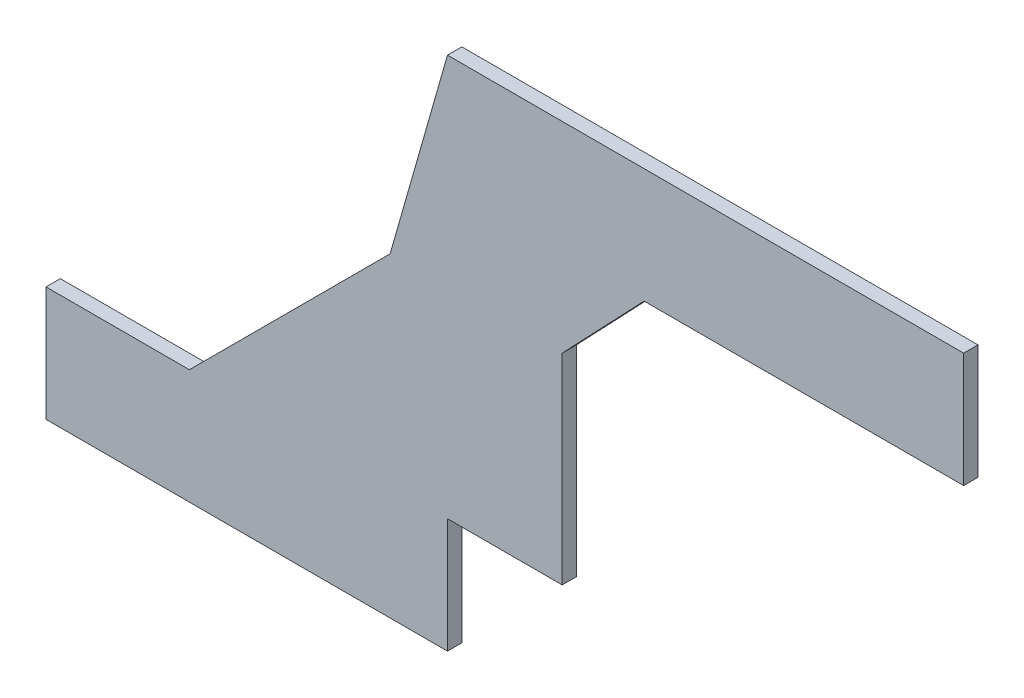
ISO-10303-21;
HEADER;
FILE_DESCRIPTION(('STEP AP214'),'2;1');
FILE_NAME('part.step','',(''),(''),'','','');
FILE_SCHEMA(('AUTOMOTIVE_DESIGN { 1 0 10303 214 1 1 1 1 }'));
ENDSEC;
DATA;
#1=APPLICATION_CONTEXT('core data for automotive mechanical design processes');
#2=APPLICATION_PROTOCOL_DEFINITION('international standard','automotive_design',2000,#1);
#3=PRODUCT_CONTEXT('',#1,'mechanical');
#4=PRODUCT('Part','Part','',(#3));
#5=PRODUCT_RELATED_PRODUCT_CATEGORY('part','',(#4));
#6=PRODUCT_DEFINITION_FORMATION('','',#4);
#7=PRODUCT_DEFINITION_CONTEXT('part definition',#1,'design');
#8=PRODUCT_DEFINITION('design','',#6,#7);
#9=PRODUCT_DEFINITION_SHAPE('','',#8);
#10=(LENGTH_UNIT() NAMED_UNIT(*) SI_UNIT(.MILLI.,.METRE.));
#11=(NAMED_UNIT(*) PLANE_ANGLE_UNIT() SI_UNIT($,.RADIAN.));
#12=(NAMED_UNIT(*) SI_UNIT($,.STERADIAN.) SOLID_ANGLE_UNIT());
#13=UNCERTAINTY_MEASURE_WITH_UNIT(LENGTH_MEASURE(1.E-05),#10,'distance_accuracy_value','');
#14=(GEOMETRIC_REPRESENTATION_CONTEXT(3) GLOBAL_UNCERTAINTY_ASSIGNED_CONTEXT((#13)) GLOBAL_UNIT_ASSIGNED_CONTEXT((#10,
#11,#12)) REPRESENTATION_CONTEXT('',''));
#15=CARTESIAN_POINT('',(0.,0.,0.));
#16=DIRECTION('',(0.,0.,1.));
#17=DIRECTION('',(1.,0.,0.));
#18=AXIS2_PLACEMENT_3D('',#15,#16,#17);
#19=CARTESIAN_POINT('',(0.,-12.7,3.175));
#20=DIRECTION('',(1.,0.,0.));
#21=DIRECTION('',(0.,0.,-1.));
#22=AXIS2_PLACEMENT_3D('',#19,#20,#21);
#23=PLANE('',#22);
#24=DIRECTION('',(0.,-1.,0.));
#25=VECTOR('',#24,1.);
#26=CARTESIAN_POINT('',(0.,-12.7,0.));
#27=LINE('',#26,#25);
#28=CARTESIAN_POINT('',(0.,12.7,0.));
#29=VERTEX_POINT('',#28);
#30=CARTESIAN_POINT('',(0.,-12.7,0.));
#31=VERTEX_POINT('',#30);
#32=EDGE_CURVE('E153',#29,#31,#27,.T.);
#33=ORIENTED_EDGE('',*,*,#32,.T.);
#34=DIRECTION('',(0.,0.,-1.));
#35=VECTOR('',#34,1.);
#36=CARTESIAN_POINT('',(0.,-12.7,3.175));
#37=LINE('',#36,#35);
#38=CARTESIAN_POINT('',(0.,-12.7,3.175));
#39=VERTEX_POINT('',#38);
#40=EDGE_CURVE('E11',#39,#31,#37,.T.);
#41=ORIENTED_EDGE('',*,*,#40,.F.);
#42=DIRECTION('',(0.,-1.,0.));
#43=VECTOR('',#42,1.);
#44=CARTESIAN_POINT('',(0.,-12.7,3.175));
#45=LINE('',#44,#43);
#46=CARTESIAN_POINT('',(0.,12.7,3.175));
#47=VERTEX_POINT('',#46);
#48=EDGE_CURVE('E175',#47,#39,#45,.T.);
#49=ORIENTED_EDGE('',*,*,#48,.F.);
#50=DIRECTION('',(0.,0.,-1.));
#51=VECTOR('',#50,1.);
#52=CARTESIAN_POINT('',(0.,12.7,3.175));
#53=LINE('',#52,#51);
#54=EDGE_CURVE('E149',#47,#29,#53,.T.);
#55=ORIENTED_EDGE('',*,*,#54,.T.);
#56=EDGE_LOOP('',(#33,#41,#49,#55));
#57=FACE_BOUND('',#56,.T.);
#58=ADVANCED_FACE('F33',(#57),#23,.F.);
#59=CARTESIAN_POINT('',(0.,-12.7,3.175));
#60=DIRECTION('',(0.,1.,0.));
#61=DIRECTION('',(0.,0.,1.));
#62=AXIS2_PLACEMENT_3D('',#59,#60,#61);
#63=PLANE('',#62);
#64=DIRECTION('',(1.,0.,0.));
#65=VECTOR('',#64,1.);
#66=CARTESIAN_POINT('',(0.,-12.7,0.));
#67=LINE('',#66,#65);
#68=CARTESIAN_POINT('',(88.9,-12.7,0.));
#69=VERTEX_POINT('',#68);
#70=EDGE_CURVE('E156',#31,#69,#67,.T.);
#71=ORIENTED_EDGE('',*,*,#70,.T.);
#72=DIRECTION('',(0.,0.,-1.));
#73=VECTOR('',#72,1.);
#74=CARTESIAN_POINT('',(88.9,-12.7,3.175));
#75=LINE('',#74,#73);
#76=CARTESIAN_POINT('',(88.9,-12.7,3.175));
#77=VERTEX_POINT('',#76);
#78=EDGE_CURVE('E41',#77,#69,#75,.T.);
#79=ORIENTED_EDGE('',*,*,#78,.F.);
#80=DIRECTION('',(1.,0.,0.));
#81=VECTOR('',#80,1.);
#82=CARTESIAN_POINT('',(0.,-12.7,3.175));
#83=LINE('',#82,#81);
#84=EDGE_CURVE('E104',#39,#77,#83,.T.);
#85=ORIENTED_EDGE('',*,*,#84,.F.);
#86=ORIENTED_EDGE('',*,*,#40,.T.);
#87=EDGE_LOOP('',(#71,#79,#85,#86));
#88=FACE_BOUND('',#87,.T.);
#89=ADVANCED_FACE('F253',(#88),#63,.F.);
#90=CARTESIAN_POINT('',(88.9,-12.7,3.175));
#91=DIRECTION('',(-1.,0.,0.));
#92=DIRECTION('',(0.,0.,1.));
#93=AXIS2_PLACEMENT_3D('',#90,#91,#92);
#94=PLANE('',#93);
#95=DIRECTION('',(0.,1.,0.));
#96=VECTOR('',#95,1.);
#97=CARTESIAN_POINT('',(88.9,-12.7,0.));
#98=LINE('',#97,#96);
#99=CARTESIAN_POINT('',(88.9,12.7,0.));
#100=VERTEX_POINT('',#99);
#101=EDGE_CURVE('E158',#69,#100,#98,.T.);
#102=ORIENTED_EDGE('',*,*,#101,.T.);
#103=DIRECTION('',(0.,0.,-1.));
#104=VECTOR('',#103,1.);
#105=CARTESIAN_POINT('',(88.9,12.7,3.175));
#106=LINE('',#105,#104);
#107=CARTESIAN_POINT('',(88.9,12.7,3.175));
#108=VERTEX_POINT('',#107);
#109=EDGE_CURVE('E194',#108,#100,#106,.T.);
#110=ORIENTED_EDGE('',*,*,#109,.F.);
#111=DIRECTION('',(0.,1.,0.));
#112=VECTOR('',#111,1.);
#113=CARTESIAN_POINT('',(88.9,-12.7,3.175));
#114=LINE('',#113,#112);
#115=EDGE_CURVE('E202',#77,#108,#114,.T.);
#116=ORIENTED_EDGE('',*,*,#115,.F.);
#117=ORIENTED_EDGE('',*,*,#78,.T.);
#118=EDGE_LOOP('',(#102,#110,#116,#117));
#119=FACE_BOUND('',#118,.T.);
#120=ADVANCED_FACE('F200',(#119),#94,.F.);
#121=CARTESIAN_POINT('',(88.9,12.7,3.175));
#122=DIRECTION('',(0.,1.,0.));
#123=DIRECTION('',(0.,0.,1.));
#124=AXIS2_PLACEMENT_3D('',#121,#122,#123);
#125=PLANE('',#124);
#126=DIRECTION('',(1.,0.,0.));
#127=VECTOR('',#126,1.);
#128=CARTESIAN_POINT('',(88.9,12.7,0.));
#129=LINE('',#128,#127);
#130=CARTESIAN_POINT('',(114.3,12.7,0.));
#131=VERTEX_POINT('',#130);
#132=EDGE_CURVE('E160',#100,#131,#129,.T.);
#133=ORIENTED_EDGE('',*,*,#132,.T.);
#134=DIRECTION('',(0.,0.,-1.));
#135=VECTOR('',#134,1.);
#136=CARTESIAN_POINT('',(114.3,12.7,3.175));
#137=LINE('',#136,#135);
#138=CARTESIAN_POINT('',(114.3,12.7,3.175));
#139=VERTEX_POINT('',#138);
#140=EDGE_CURVE('E191',#139,#131,#137,.T.);
#141=ORIENTED_EDGE('',*,*,#140,.F.);
#142=DIRECTION('',(1.,0.,0.));
#143=VECTOR('',#142,1.);
#144=CARTESIAN_POINT('',(88.9,12.7,3.175));
#145=LINE('',#144,#143);
#146=EDGE_CURVE('E220',#108,#139,#145,.T.);
#147=ORIENTED_EDGE('',*,*,#146,.F.);
#148=ORIENTED_EDGE('',*,*,#109,.T.);
#149=EDGE_LOOP('',(#133,#141,#147,#148));
#150=FACE_BOUND('',#149,.T.);
#151=ADVANCED_FACE('F211',(#150),#125,.F.);
#152=CARTESIAN_POINT('',(114.3,12.7,3.175));
#153=DIRECTION('',(-1.,0.,0.));
#154=DIRECTION('',(0.,0.,1.));
#155=AXIS2_PLACEMENT_3D('',#152,#153,#154);
#156=PLANE('',#155);
#157=DIRECTION('',(0.,1.,0.));
#158=VECTOR('',#157,1.);
#159=CARTESIAN_POINT('',(114.3,12.7,0.));
#160=LINE('',#159,#158);
#161=CARTESIAN_POINT('',(114.3,57.15,0.));
#162=VERTEX_POINT('',#161);
#163=EDGE_CURVE('E162',#131,#162,#160,.T.);
#164=ORIENTED_EDGE('',*,*,#163,.T.);
#165=DIRECTION('',(0.,0.,-1.));
#166=VECTOR('',#165,1.);
#167=CARTESIAN_POINT('',(114.3,57.15,3.175));
#168=LINE('',#167,#166);
#169=CARTESIAN_POINT('',(114.3,57.15,3.175));
#170=VERTEX_POINT('',#169);
#171=EDGE_CURVE('E188',#170,#162,#168,.T.);
#172=ORIENTED_EDGE('',*,*,#171,.F.);
#173=DIRECTION('',(0.,1.,0.));
#174=VECTOR('',#173,1.);
#175=CARTESIAN_POINT('',(114.3,12.7,3.175));
#176=LINE('',#175,#174);
#177=EDGE_CURVE('E217',#139,#170,#176,.T.);
#178=ORIENTED_EDGE('',*,*,#177,.F.);
#179=ORIENTED_EDGE('',*,*,#140,.T.);
#180=EDGE_LOOP('',(#164,#172,#178,#179));
#181=FACE_BOUND('',#180,.T.);
#182=ADVANCED_FACE('F215',(#181),#156,.F.);
#183=CARTESIAN_POINT('',(114.3,57.15,3.175));
#184=DIRECTION('',(-0.724137931034483,0.689655172413793,0.));
#185=DIRECTION('',(-0.689655172413793,-0.724137931034483,0.));
#186=AXIS2_PLACEMENT_3D('',#183,#184,#185);
#187=PLANE('',#186);
#188=DIRECTION('',(0.689655172413793,0.724137931034483,0.));
#189=VECTOR('',#188,1.);
#190=CARTESIAN_POINT('',(114.3,57.15,0.));
#191=LINE('',#190,#189);
#192=CARTESIAN_POINT('',(132.442857142857,76.2,0.));
#193=VERTEX_POINT('',#192);
#194=EDGE_CURVE('E164',#162,#193,#191,.T.);
#195=ORIENTED_EDGE('',*,*,#194,.T.);
#196=DIRECTION('',(0.,0.,-1.));
#197=VECTOR('',#196,1.);
#198=CARTESIAN_POINT('',(132.442857142857,76.2,3.175));
#199=LINE('',#198,#197);
#200=CARTESIAN_POINT('',(132.442857142857,76.2,3.175));
#201=VERTEX_POINT('',#200);
#202=EDGE_CURVE('E185',#201,#193,#199,.T.);
#203=ORIENTED_EDGE('',*,*,#202,.F.);
#204=DIRECTION('',(0.689655172413793,0.724137931034483,0.));
#205=VECTOR('',#204,1.);
#206=CARTESIAN_POINT('',(114.3,57.15,3.175));
#207=LINE('',#206,#205);
#208=EDGE_CURVE('E219',#170,#201,#207,.T.);
#209=ORIENTED_EDGE('',*,*,#208,.F.);
#210=ORIENTED_EDGE('',*,*,#171,.T.);
#211=EDGE_LOOP('',(#195,#203,#209,#210));
#212=FACE_BOUND('',#211,.T.);
#213=ADVANCED_FACE('F266',(#212),#187,.F.);
#214=CARTESIAN_POINT('',(132.442857142857,76.2,3.175));
#215=DIRECTION('',(0.,1.,0.));
#216=DIRECTION('',(-1.,0.,0.));
#217=AXIS2_PLACEMENT_3D('',#214,#215,#216);
#218=PLANE('',#217);
#219=DIRECTION('',(1.,0.,0.));
#220=VECTOR('',#219,1.);
#221=CARTESIAN_POINT('',(132.442857142857,76.2,0.));
#222=LINE('',#221,#220);
#223=CARTESIAN_POINT('',(203.2,76.2,0.));
#224=VERTEX_POINT('',#223);
#225=EDGE_CURVE('E166',#193,#224,#222,.T.);
#226=ORIENTED_EDGE('',*,*,#225,.T.);
#227=DIRECTION('',(0.,0.,-1.));
#228=VECTOR('',#227,1.);
#229=CARTESIAN_POINT('',(203.2,76.2,3.175));
#230=LINE('',#229,#228);
#231=CARTESIAN_POINT('',(203.2,76.2,3.175));
#232=VERTEX_POINT('',#231);
#233=EDGE_CURVE('E182',#232,#224,#230,.T.);
#234=ORIENTED_EDGE('',*,*,#233,.F.);
#235=DIRECTION('',(1.,0.,0.));
#236=VECTOR('',#235,1.);
#237=CARTESIAN_POINT('',(132.442857142857,76.2,3.175));
#238=LINE('',#237,#236);
#239=EDGE_CURVE('E222',#201,#232,#238,.T.);
#240=ORIENTED_EDGE('',*,*,#239,.F.);
#241=ORIENTED_EDGE('',*,*,#202,.T.);
#242=EDGE_LOOP('',(#226,#234,#240,#241));
#243=FACE_BOUND('',#242,.T.);
#244=ADVANCED_FACE('F269',(#243),#218,.F.);
#245=CARTESIAN_POINT('',(203.2,76.2,3.175));
#246=DIRECTION('',(-1.,0.,0.));
#247=DIRECTION('',(0.,0.,1.));
#248=AXIS2_PLACEMENT_3D('',#245,#246,#247);
#249=PLANE('',#248);
#250=DIRECTION('',(0.,1.,0.));
#251=VECTOR('',#250,1.);
#252=CARTESIAN_POINT('',(203.2,76.2,0.));
#253=LINE('',#252,#251);
#254=CARTESIAN_POINT('',(203.2,101.6,0.));
#255=VERTEX_POINT('',#254);
#256=EDGE_CURVE('E168',#224,#255,#253,.T.);
#257=ORIENTED_EDGE('',*,*,#256,.T.);
#258=DIRECTION('',(0.,0.,-1.));
#259=VECTOR('',#258,1.);
#260=CARTESIAN_POINT('',(203.2,101.6,3.175));
#261=LINE('',#260,#259);
#262=CARTESIAN_POINT('',(203.2,101.6,3.175));
#263=VERTEX_POINT('',#262);
#264=EDGE_CURVE('E179',#263,#255,#261,.T.);
#265=ORIENTED_EDGE('',*,*,#264,.F.);
#266=DIRECTION('',(0.,1.,0.));
#267=VECTOR('',#266,1.);
#268=CARTESIAN_POINT('',(203.2,76.2,3.175));
#269=LINE('',#268,#267);
#270=EDGE_CURVE('E228',#232,#263,#269,.T.);
#271=ORIENTED_EDGE('',*,*,#270,.F.);
#272=ORIENTED_EDGE('',*,*,#233,.T.);
#273=EDGE_LOOP('',(#257,#265,#271,#272));
#274=FACE_BOUND('',#273,.T.);
#275=ADVANCED_FACE('F234',(#274),#249,.F.);
#276=CARTESIAN_POINT('',(88.9,101.6,3.175));
#277=DIRECTION('',(0.,-1.,0.));
#278=DIRECTION('',(1.,0.,0.));
#279=AXIS2_PLACEMENT_3D('',#276,#277,#278);
#280=PLANE('',#279);
#281=DIRECTION('',(-1.,0.,0.));
#282=VECTOR('',#281,1.);
#283=CARTESIAN_POINT('',(88.9,101.6,0.));
#284=LINE('',#283,#282);
#285=CARTESIAN_POINT('',(88.9,101.6,0.));
#286=VERTEX_POINT('',#285);
#287=EDGE_CURVE('E170',#255,#286,#284,.T.);
#288=ORIENTED_EDGE('',*,*,#287,.T.);
#289=DIRECTION('',(0.,0.,-1.));
#290=VECTOR('',#289,1.);
#291=CARTESIAN_POINT('',(88.9,101.6,3.175));
#292=LINE('',#291,#290);
#293=CARTESIAN_POINT('',(88.9,101.6,3.175));
#294=VERTEX_POINT('',#293);
#295=EDGE_CURVE('E144',#294,#286,#292,.T.);
#296=ORIENTED_EDGE('',*,*,#295,.F.);
#297=DIRECTION('',(-1.,0.,0.));
#298=VECTOR('',#297,1.);
#299=CARTESIAN_POINT('',(88.9,101.6,3.175));
#300=LINE('',#299,#298);
#301=EDGE_CURVE('E135',#263,#294,#300,.T.);
#302=ORIENTED_EDGE('',*,*,#301,.F.);
#303=ORIENTED_EDGE('',*,*,#264,.T.);
#304=EDGE_LOOP('',(#288,#296,#302,#303));
#305=FACE_BOUND('',#304,.T.);
#306=ADVANCED_FACE('F238',(#305),#280,.F.);
#307=CARTESIAN_POINT('',(76.2,57.15,3.175));
#308=DIRECTION('',(0.961523947640823,-0.274721127897378,0.));
#309=DIRECTION('',(0.274721127897378,0.961523947640823,0.));
#310=AXIS2_PLACEMENT_3D('',#307,#308,#309);
#311=PLANE('',#310);
#312=DIRECTION('',(-0.274721127897378,-0.961523947640823,0.));
#313=VECTOR('',#312,1.);
#314=CARTESIAN_POINT('',(76.2,57.15,0.));
#315=LINE('',#314,#313);
#316=CARTESIAN_POINT('',(76.2,57.15,0.));
#317=VERTEX_POINT('',#316);
#318=EDGE_CURVE('E143',#286,#317,#315,.T.);
#319=ORIENTED_EDGE('',*,*,#318,.T.);
#320=DIRECTION('',(0.,0.,-1.));
#321=VECTOR('',#320,1.);
#322=CARTESIAN_POINT('',(76.2,57.15,3.175));
#323=LINE('',#322,#321);
#324=CARTESIAN_POINT('',(76.2,57.15,3.175));
#325=VERTEX_POINT('',#324);
#326=EDGE_CURVE('E140',#325,#317,#323,.T.);
#327=ORIENTED_EDGE('',*,*,#326,.F.);
#328=DIRECTION('',(-0.274721127897378,-0.961523947640823,0.));
#329=VECTOR('',#328,1.);
#330=CARTESIAN_POINT('',(76.2,57.15,3.175));
#331=LINE('',#330,#329);
#332=EDGE_CURVE('E129',#294,#325,#331,.T.);
#333=ORIENTED_EDGE('',*,*,#332,.F.);
#334=ORIENTED_EDGE('',*,*,#295,.T.);
#335=EDGE_LOOP('',(#319,#327,#333,#334));
#336=FACE_BOUND('',#335,.T.);
#337=ADVANCED_FACE('F141',(#336),#311,.F.);
#338=CARTESIAN_POINT('',(76.2,57.15,3.175));
#339=DIRECTION('',(0.707106781186547,-0.707106781186548,0.));
#340=DIRECTION('',(0.707106781186548,0.707106781186547,0.));
#341=AXIS2_PLACEMENT_3D('',#338,#339,#340);
#342=PLANE('',#341);
#343=DIRECTION('',(-0.707106781186548,-0.707106781186547,0.));
#344=VECTOR('',#343,1.);
#345=CARTESIAN_POINT('',(76.2,57.15,0.));
#346=LINE('',#345,#344);
#347=CARTESIAN_POINT('',(31.75,12.7,0.));
#348=VERTEX_POINT('',#347);
#349=EDGE_CURVE('E90',#317,#348,#346,.T.);
#350=ORIENTED_EDGE('',*,*,#349,.T.);
#351=DIRECTION('',(0.,0.,-1.));
#352=VECTOR('',#351,1.);
#353=CARTESIAN_POINT('',(31.75,12.7,3.175));
#354=LINE('',#353,#352);
#355=CARTESIAN_POINT('',(31.75,12.7,3.175));
#356=VERTEX_POINT('',#355);
#357=EDGE_CURVE('E145',#356,#348,#354,.T.);
#358=ORIENTED_EDGE('',*,*,#357,.F.);
#359=DIRECTION('',(-0.707106781186548,-0.707106781186547,0.));
#360=VECTOR('',#359,1.);
#361=CARTESIAN_POINT('',(76.2,57.15,3.175));
#362=LINE('',#361,#360);
#363=EDGE_CURVE('E133',#325,#356,#362,.T.);
#364=ORIENTED_EDGE('',*,*,#363,.F.);
#365=ORIENTED_EDGE('',*,*,#326,.T.);
#366=EDGE_LOOP('',(#350,#358,#364,#365));
#367=FACE_BOUND('',#366,.T.);
#368=ADVANCED_FACE('F147',(#367),#342,.F.);
#369=CARTESIAN_POINT('',(0.,12.7,3.175));
#370=DIRECTION('',(0.,-1.,0.));
#371=DIRECTION('',(0.,0.,-1.));
#372=AXIS2_PLACEMENT_3D('',#369,#370,#371);
#373=PLANE('',#372);
#374=DIRECTION('',(-1.,0.,0.));
#375=VECTOR('',#374,1.);
#376=CARTESIAN_POINT('',(0.,12.7,0.));
#377=LINE('',#376,#375);
#378=EDGE_CURVE('E96',#348,#29,#377,.T.);
#379=ORIENTED_EDGE('',*,*,#378,.T.);
#380=ORIENTED_EDGE('',*,*,#54,.F.);
#381=DIRECTION('',(-1.,0.,0.));
#382=VECTOR('',#381,1.);
#383=CARTESIAN_POINT('',(0.,12.7,3.175));
#384=LINE('',#383,#382);
#385=EDGE_CURVE('E49',#356,#47,#384,.T.);
#386=ORIENTED_EDGE('',*,*,#385,.F.);
#387=ORIENTED_EDGE('',*,*,#357,.T.);
#388=EDGE_LOOP('',(#379,#380,#386,#387));
#389=FACE_BOUND('',#388,.T.);
#390=ADVANCED_FACE('F242',(#389),#373,.F.);
#391=CARTESIAN_POINT('',(0.,0.,3.175));
#392=DIRECTION('',(0.,0.,-1.));
#393=DIRECTION('',(-1.,0.,0.));
#394=AXIS2_PLACEMENT_3D('',#391,#392,#393);
#395=PLANE('',#394);
#396=ORIENTED_EDGE('',*,*,#48,.T.);
#397=ORIENTED_EDGE('',*,*,#84,.T.);
#398=ORIENTED_EDGE('',*,*,#115,.T.);
#399=ORIENTED_EDGE('',*,*,#146,.T.);
#400=ORIENTED_EDGE('',*,*,#177,.T.);
#401=ORIENTED_EDGE('',*,*,#208,.T.);
#402=ORIENTED_EDGE('',*,*,#239,.T.);
#403=ORIENTED_EDGE('',*,*,#270,.T.);
#404=ORIENTED_EDGE('',*,*,#301,.T.);
#405=ORIENTED_EDGE('',*,*,#332,.T.);
#406=ORIENTED_EDGE('',*,*,#363,.T.);
#407=ORIENTED_EDGE('',*,*,#385,.T.);
#408=EDGE_LOOP('',(#396,#397,#398,#399,#400,#401,#402,#403,#404,#405,#406,#407));
#409=FACE_BOUND('',#408,.T.);
#410=ADVANCED_FACE('F131',(#409),#395,.F.);
#411=CARTESIAN_POINT('',(0.,0.,0.));
#412=DIRECTION('',(0.,0.,-1.));
#413=DIRECTION('',(-1.,0.,0.));
#414=AXIS2_PLACEMENT_3D('',#411,#412,#413);
#415=PLANE('',#414);
#416=ORIENTED_EDGE('',*,*,#32,.F.);
#417=ORIENTED_EDGE('',*,*,#378,.F.);
#418=ORIENTED_EDGE('',*,*,#349,.F.);
#419=ORIENTED_EDGE('',*,*,#318,.F.);
#420=ORIENTED_EDGE('',*,*,#287,.F.);
#421=ORIENTED_EDGE('',*,*,#256,.F.);
#422=ORIENTED_EDGE('',*,*,#225,.F.);
#423=ORIENTED_EDGE('',*,*,#194,.F.);
#424=ORIENTED_EDGE('',*,*,#163,.F.);
#425=ORIENTED_EDGE('',*,*,#132,.F.);
#426=ORIENTED_EDGE('',*,*,#101,.F.);
#427=ORIENTED_EDGE('',*,*,#70,.F.);
#428=EDGE_LOOP('',(#416,#417,#418,#419,#420,#421,#422,#423,#424,#425,#426,#427));
#429=FACE_BOUND('',#428,.T.);
#430=ADVANCED_FACE('F206',(#429),#415,.T.);
#431=CLOSED_SHELL('',(#58,#89,#120,#151,#182,#213,#244,#275,#306,#337,#368,#390,#410,#430));
#432=MANIFOLD_SOLID_BREP('B2',#431);
#433=ADVANCED_BREP_SHAPE_REPRESENTATION('',(#18,#432),#14);
#434=SHAPE_DEFINITION_REPRESENTATION(#9,#433);
ENDSEC;
END-ISO-10303-21;
